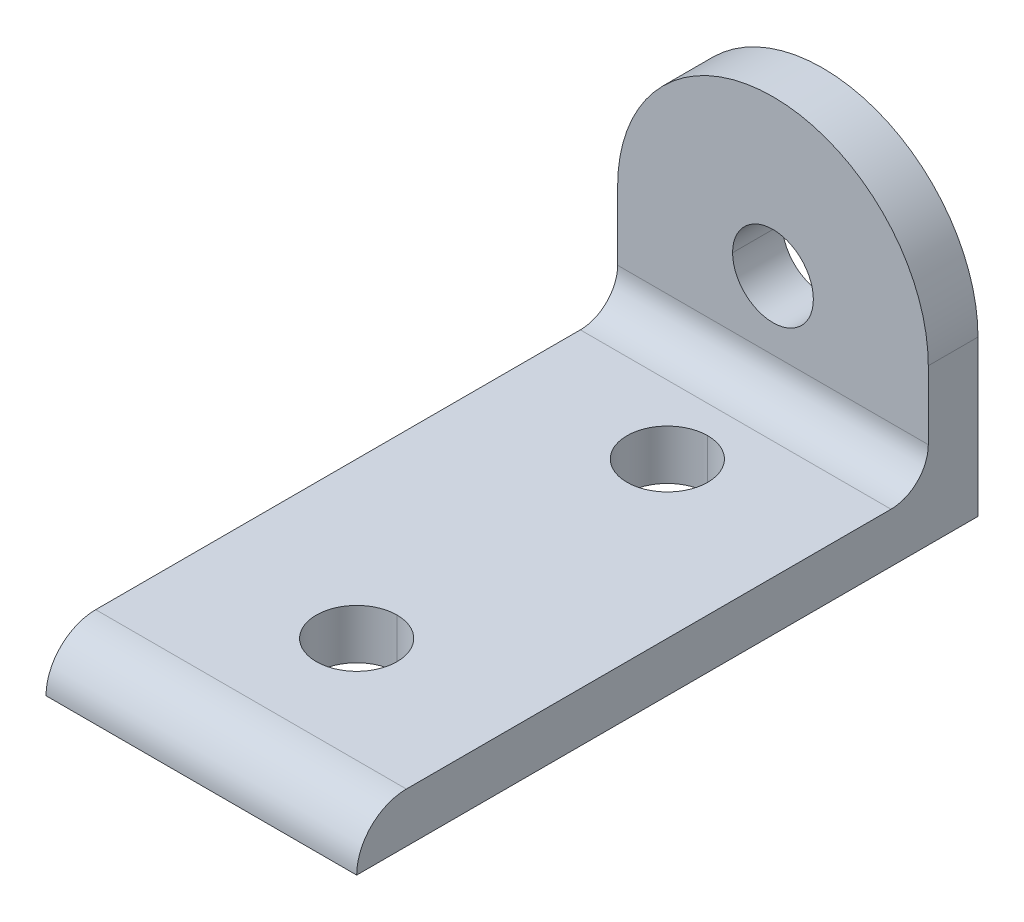
ISO-10303-21;
HEADER;
FILE_DESCRIPTION(('STEP AP214'),'2;1');
FILE_NAME('part.step','',(''),(''),'','','');
FILE_SCHEMA(('AUTOMOTIVE_DESIGN { 1 0 10303 214 1 1 1 1 }'));
ENDSEC;
DATA;
#1=APPLICATION_CONTEXT('core data for automotive mechanical design processes');
#2=APPLICATION_PROTOCOL_DEFINITION('international standard','automotive_design',2000,#1);
#3=PRODUCT_CONTEXT('',#1,'mechanical');
#4=PRODUCT('Part','Part','',(#3));
#5=PRODUCT_RELATED_PRODUCT_CATEGORY('part','',(#4));
#6=PRODUCT_DEFINITION_FORMATION('','',#4);
#7=PRODUCT_DEFINITION_CONTEXT('part definition',#1,'design');
#8=PRODUCT_DEFINITION('design','',#6,#7);
#9=PRODUCT_DEFINITION_SHAPE('','',#8);
#10=(LENGTH_UNIT() NAMED_UNIT(*) SI_UNIT(.MILLI.,.METRE.));
#11=(NAMED_UNIT(*) PLANE_ANGLE_UNIT() SI_UNIT($,.RADIAN.));
#12=(NAMED_UNIT(*) SI_UNIT($,.STERADIAN.) SOLID_ANGLE_UNIT());
#13=UNCERTAINTY_MEASURE_WITH_UNIT(LENGTH_MEASURE(1.E-05),#10,'distance_accuracy_value','');
#14=(GEOMETRIC_REPRESENTATION_CONTEXT(3) GLOBAL_UNCERTAINTY_ASSIGNED_CONTEXT((#13)) GLOBAL_UNIT_ASSIGNED_CONTEXT((#10,
#11,#12)) REPRESENTATION_CONTEXT('',''));
#15=CARTESIAN_POINT('',(0.,0.,0.));
#16=DIRECTION('',(0.,0.,1.));
#17=DIRECTION('',(1.,0.,0.));
#18=AXIS2_PLACEMENT_3D('',#15,#16,#17);
#19=CARTESIAN_POINT('',(12.5,-3.15719672627779E-13,46.));
#20=DIRECTION('',(1.,0.,0.));
#21=DIRECTION('',(0.,0.,-1.));
#22=AXIS2_PLACEMENT_3D('',#19,#20,#21);
#23=PLANE('',#22);
#24=DIRECTION('',(0.,1.,0.));
#25=VECTOR('',#24,1.);
#26=CARTESIAN_POINT('',(12.5,0.,0.));
#27=LINE('',#26,#25);
#28=CARTESIAN_POINT('',(12.5,0.,0.));
#29=VERTEX_POINT('',#28);
#30=CARTESIAN_POINT('',(12.5,12.5,0.));
#31=VERTEX_POINT('',#30);
#32=EDGE_CURVE('E11',#29,#31,#27,.T.);
#33=ORIENTED_EDGE('',*,*,#32,.T.);
#34=DIRECTION('',(0.,0.,-1.));
#35=VECTOR('',#34,1.);
#36=CARTESIAN_POINT('',(12.5,12.5,4.));
#37=LINE('',#36,#35);
#38=CARTESIAN_POINT('',(12.5,12.5,4.));
#39=VERTEX_POINT('',#38);
#40=EDGE_CURVE('E24',#39,#31,#37,.T.);
#41=ORIENTED_EDGE('',*,*,#40,.F.);
#42=DIRECTION('',(0.,-1.,0.));
#43=VECTOR('',#42,1.);
#44=CARTESIAN_POINT('',(12.5,25.,4.));
#45=LINE('',#44,#43);
#46=CARTESIAN_POINT('',(12.5,7.,4.));
#47=VERTEX_POINT('',#46);
#48=EDGE_CURVE('E259',#39,#47,#45,.T.);
#49=ORIENTED_EDGE('',*,*,#48,.T.);
#50=CARTESIAN_POINT('',(12.5,7.00000000000015,7.00000000000015));
#51=DIRECTION('',(1.,0.,0.));
#52=DIRECTION('',(0.,0.,-1.));
#53=AXIS2_PLACEMENT_3D('',#50,#51,#52);
#54=CIRCLE('',#53,3.00000000000014);
#55=CARTESIAN_POINT('',(12.5,4.,7.));
#56=VERTEX_POINT('',#55);
#57=EDGE_CURVE('E254',#56,#47,#54,.T.);
#58=ORIENTED_EDGE('',*,*,#57,.F.);
#59=DIRECTION('',(0.,0.,1.));
#60=VECTOR('',#59,1.);
#61=CARTESIAN_POINT('',(12.5,4.,7.));
#62=LINE('',#61,#60);
#63=CARTESIAN_POINT('',(12.5,4.,46.));
#64=VERTEX_POINT('',#63);
#65=EDGE_CURVE('E250',#56,#64,#62,.T.);
#66=ORIENTED_EDGE('',*,*,#65,.T.);
#67=CARTESIAN_POINT('',(12.5,-3.15719672627779E-13,46.));
#68=DIRECTION('',(1.,0.,0.));
#69=DIRECTION('',(0.,0.,-1.));
#70=AXIS2_PLACEMENT_3D('',#67,#68,#69);
#71=CIRCLE('',#70,4.00000000000032);
#72=CARTESIAN_POINT('',(12.5,0.,50.));
#73=VERTEX_POINT('',#72);
#74=EDGE_CURVE('E246',#64,#73,#71,.T.);
#75=ORIENTED_EDGE('',*,*,#74,.T.);
#76=DIRECTION('',(0.,0.,-1.));
#77=VECTOR('',#76,1.);
#78=CARTESIAN_POINT('',(12.5,0.,50.));
#79=LINE('',#78,#77);
#80=EDGE_CURVE('E242',#73,#29,#79,.T.);
#81=ORIENTED_EDGE('',*,*,#80,.T.);
#82=EDGE_LOOP('',(#33,#41,#49,#58,#66,#75,#81));
#83=FACE_BOUND('',#82,.T.);
#84=ADVANCED_FACE('F16',(#83),#23,.T.);
#85=CARTESIAN_POINT('',(12.5,0.,50.));
#86=DIRECTION('',(0.,1.,0.));
#87=DIRECTION('',(0.,0.,1.));
#88=AXIS2_PLACEMENT_3D('',#85,#86,#87);
#89=PLANE('',#88);
#90=CARTESIAN_POINT('',(0.,0.,12.5));
#91=DIRECTION('',(0.,1.,0.));
#92=DIRECTION('',(1.,0.,0.));
#93=AXIS2_PLACEMENT_3D('',#90,#91,#92);
#94=CIRCLE('',#93,3.25);
#95=CARTESIAN_POINT('',(0.,0.,9.25));
#96=VERTEX_POINT('',#95);
#97=CARTESIAN_POINT('',(0.,0.,15.75));
#98=VERTEX_POINT('',#97);
#99=EDGE_CURVE('E238',#96,#98,#94,.T.);
#100=ORIENTED_EDGE('',*,*,#99,.T.);
#101=CARTESIAN_POINT('',(0.,0.,12.5));
#102=DIRECTION('',(0.,1.,0.));
#103=DIRECTION('',(0.,0.,1.));
#104=AXIS2_PLACEMENT_3D('',#101,#102,#103);
#105=CIRCLE('',#104,3.25);
#106=EDGE_CURVE('E234',#98,#96,#105,.T.);
#107=ORIENTED_EDGE('',*,*,#106,.T.);
#108=EDGE_LOOP('',(#100,#107));
#109=FACE_BOUND('',#108,.T.);
#110=CARTESIAN_POINT('',(0.,0.,37.5));
#111=DIRECTION('',(0.,1.,0.));
#112=DIRECTION('',(1.,0.,0.));
#113=AXIS2_PLACEMENT_3D('',#110,#111,#112);
#114=CIRCLE('',#113,3.25);
#115=CARTESIAN_POINT('',(0.,0.,34.25));
#116=VERTEX_POINT('',#115);
#117=CARTESIAN_POINT('',(0.,0.,40.75));
#118=VERTEX_POINT('',#117);
#119=EDGE_CURVE('E230',#116,#118,#114,.T.);
#120=ORIENTED_EDGE('',*,*,#119,.T.);
#121=CARTESIAN_POINT('',(0.,0.,37.5));
#122=DIRECTION('',(0.,1.,0.));
#123=DIRECTION('',(0.,0.,1.));
#124=AXIS2_PLACEMENT_3D('',#121,#122,#123);
#125=CIRCLE('',#124,3.25);
#126=EDGE_CURVE('E226',#118,#116,#125,.T.);
#127=ORIENTED_EDGE('',*,*,#126,.T.);
#128=EDGE_LOOP('',(#120,#127));
#129=FACE_BOUND('',#128,.T.);
#130=DIRECTION('',(0.,0.,-1.));
#131=VECTOR('',#130,1.);
#132=CARTESIAN_POINT('',(-12.5,0.,50.));
#133=LINE('',#132,#131);
#134=CARTESIAN_POINT('',(-12.5,0.,50.));
#135=VERTEX_POINT('',#134);
#136=CARTESIAN_POINT('',(-12.5,0.,0.));
#137=VERTEX_POINT('',#136);
#138=EDGE_CURVE('E222',#135,#137,#133,.T.);
#139=ORIENTED_EDGE('',*,*,#138,.T.);
#140=DIRECTION('',(-1.,0.,0.));
#141=VECTOR('',#140,1.);
#142=CARTESIAN_POINT('',(12.5,0.,0.));
#143=LINE('',#142,#141);
#144=EDGE_CURVE('E217',#29,#137,#143,.T.);
#145=ORIENTED_EDGE('',*,*,#144,.F.);
#146=ORIENTED_EDGE('',*,*,#80,.F.);
#147=DIRECTION('',(-1.,0.,0.));
#148=VECTOR('',#147,1.);
#149=CARTESIAN_POINT('',(12.5,0.,50.));
#150=LINE('',#149,#148);
#151=EDGE_CURVE('E213',#73,#135,#150,.T.);
#152=ORIENTED_EDGE('',*,*,#151,.T.);
#153=EDGE_LOOP('',(#139,#145,#146,#152));
#154=FACE_BOUND('',#153,.T.);
#155=ADVANCED_FACE('F292',(#109,#129,#154),#89,.F.);
#156=CARTESIAN_POINT('',(12.5,-3.15719672627779E-13,46.));
#157=DIRECTION('',(-1.,0.,0.));
#158=DIRECTION('',(0.,-0.707106781186576,-0.707106781186519));
#159=AXIS2_PLACEMENT_3D('',#156,#157,#158);
#160=CYLINDRICAL_SURFACE('',#159,4.00000000000032);
#161=CARTESIAN_POINT('',(-12.5,-3.15719672627779E-13,46.));
#162=DIRECTION('',(1.,0.,0.));
#163=DIRECTION('',(0.,0.,-1.));
#164=AXIS2_PLACEMENT_3D('',#161,#162,#163);
#165=CIRCLE('',#164,4.00000000000032);
#166=CARTESIAN_POINT('',(-12.5,4.,46.));
#167=VERTEX_POINT('',#166);
#168=EDGE_CURVE('E208',#167,#135,#165,.T.);
#169=ORIENTED_EDGE('',*,*,#168,.T.);
#170=ORIENTED_EDGE('',*,*,#151,.F.);
#171=ORIENTED_EDGE('',*,*,#74,.F.);
#172=DIRECTION('',(-1.,0.,0.));
#173=VECTOR('',#172,1.);
#174=CARTESIAN_POINT('',(12.5,4.,46.));
#175=LINE('',#174,#173);
#176=EDGE_CURVE('E204',#64,#167,#175,.T.);
#177=ORIENTED_EDGE('',*,*,#176,.T.);
#178=EDGE_LOOP('',(#169,#170,#171,#177));
#179=FACE_BOUND('',#178,.T.);
#180=ADVANCED_FACE('F288',(#179),#160,.T.);
#181=CARTESIAN_POINT('',(12.5,4.,7.));
#182=DIRECTION('',(0.,-1.,0.));
#183=DIRECTION('',(0.,0.,-1.));
#184=AXIS2_PLACEMENT_3D('',#181,#182,#183);
#185=PLANE('',#184);
#186=CARTESIAN_POINT('',(0.,4.,12.5));
#187=DIRECTION('',(0.,1.,0.));
#188=DIRECTION('',(1.,0.,0.));
#189=AXIS2_PLACEMENT_3D('',#186,#187,#188);
#190=CIRCLE('',#189,3.25);
#191=CARTESIAN_POINT('',(0.,4.,9.25));
#192=VERTEX_POINT('',#191);
#193=CARTESIAN_POINT('',(0.,4.,15.75));
#194=VERTEX_POINT('',#193);
#195=EDGE_CURVE('E199',#192,#194,#190,.T.);
#196=ORIENTED_EDGE('',*,*,#195,.F.);
#197=CARTESIAN_POINT('',(0.,4.,12.5));
#198=DIRECTION('',(0.,1.,0.));
#199=DIRECTION('',(0.,0.,1.));
#200=AXIS2_PLACEMENT_3D('',#197,#198,#199);
#201=CIRCLE('',#200,3.25);
#202=EDGE_CURVE('E194',#194,#192,#201,.T.);
#203=ORIENTED_EDGE('',*,*,#202,.F.);
#204=EDGE_LOOP('',(#196,#203));
#205=FACE_BOUND('',#204,.T.);
#206=CARTESIAN_POINT('',(0.,4.,37.5));
#207=DIRECTION('',(0.,1.,0.));
#208=DIRECTION('',(1.,0.,0.));
#209=AXIS2_PLACEMENT_3D('',#206,#207,#208);
#210=CIRCLE('',#209,3.25);
#211=CARTESIAN_POINT('',(0.,4.,34.25));
#212=VERTEX_POINT('',#211);
#213=CARTESIAN_POINT('',(0.,4.,40.75));
#214=VERTEX_POINT('',#213);
#215=EDGE_CURVE('E189',#212,#214,#210,.T.);
#216=ORIENTED_EDGE('',*,*,#215,.F.);
#217=CARTESIAN_POINT('',(0.,4.,37.5));
#218=DIRECTION('',(0.,1.,0.));
#219=DIRECTION('',(0.,0.,1.));
#220=AXIS2_PLACEMENT_3D('',#217,#218,#219);
#221=CIRCLE('',#220,3.25);
#222=EDGE_CURVE('E184',#214,#212,#221,.T.);
#223=ORIENTED_EDGE('',*,*,#222,.F.);
#224=EDGE_LOOP('',(#216,#223));
#225=FACE_BOUND('',#224,.T.);
#226=DIRECTION('',(0.,0.,1.));
#227=VECTOR('',#226,1.);
#228=CARTESIAN_POINT('',(-12.5,4.,7.));
#229=LINE('',#228,#227);
#230=CARTESIAN_POINT('',(-12.5,4.,7.));
#231=VERTEX_POINT('',#230);
#232=EDGE_CURVE('E179',#231,#167,#229,.T.);
#233=ORIENTED_EDGE('',*,*,#232,.T.);
#234=ORIENTED_EDGE('',*,*,#176,.F.);
#235=ORIENTED_EDGE('',*,*,#65,.F.);
#236=DIRECTION('',(-1.,0.,0.));
#237=VECTOR('',#236,1.);
#238=CARTESIAN_POINT('',(12.5,4.,7.));
#239=LINE('',#238,#237);
#240=EDGE_CURVE('E175',#56,#231,#239,.T.);
#241=ORIENTED_EDGE('',*,*,#240,.T.);
#242=EDGE_LOOP('',(#233,#234,#235,#241));
#243=FACE_BOUND('',#242,.T.);
#244=ADVANCED_FACE('F283',(#205,#225,#243),#185,.F.);
#245=CARTESIAN_POINT('',(12.5,7.00000000000015,7.00000000000015));
#246=DIRECTION('',(-1.,0.,0.));
#247=DIRECTION('',(0.,0.70710678118653,0.707106781186565));
#248=AXIS2_PLACEMENT_3D('',#245,#246,#247);
#249=CYLINDRICAL_SURFACE('',#248,3.00000000000014);
#250=CARTESIAN_POINT('',(-12.5,7.00000000000015,7.00000000000015));
#251=DIRECTION('',(1.,0.,0.));
#252=DIRECTION('',(0.,0.,-1.));
#253=AXIS2_PLACEMENT_3D('',#250,#251,#252);
#254=CIRCLE('',#253,3.00000000000014);
#255=CARTESIAN_POINT('',(-12.5,7.,4.));
#256=VERTEX_POINT('',#255);
#257=EDGE_CURVE('E170',#231,#256,#254,.T.);
#258=ORIENTED_EDGE('',*,*,#257,.F.);
#259=ORIENTED_EDGE('',*,*,#240,.F.);
#260=ORIENTED_EDGE('',*,*,#57,.T.);
#261=DIRECTION('',(-1.,0.,0.));
#262=VECTOR('',#261,1.);
#263=CARTESIAN_POINT('',(12.5,7.,4.));
#264=LINE('',#263,#262);
#265=EDGE_CURVE('E166',#47,#256,#264,.T.);
#266=ORIENTED_EDGE('',*,*,#265,.T.);
#267=EDGE_LOOP('',(#258,#259,#260,#266));
#268=FACE_BOUND('',#267,.T.);
#269=ADVANCED_FACE('F280',(#268),#249,.F.);
#270=CARTESIAN_POINT('',(12.5,25.,4.));
#271=DIRECTION('',(0.,0.,-1.));
#272=DIRECTION('',(-1.,0.,0.));
#273=AXIS2_PLACEMENT_3D('',#270,#271,#272);
#274=PLANE('',#273);
#275=CARTESIAN_POINT('',(0.,12.5,4.));
#276=DIRECTION('',(0.,0.,1.));
#277=DIRECTION('',(1.,0.,0.));
#278=AXIS2_PLACEMENT_3D('',#275,#276,#277);
#279=CIRCLE('',#278,3.25);
#280=CARTESIAN_POINT('',(-3.25,12.5,4.));
#281=VERTEX_POINT('',#280);
#282=CARTESIAN_POINT('',(3.25,12.5,4.));
#283=VERTEX_POINT('',#282);
#284=EDGE_CURVE('E127',#281,#283,#279,.T.);
#285=ORIENTED_EDGE('',*,*,#284,.F.);
#286=CARTESIAN_POINT('',(0.,12.5,4.));
#287=DIRECTION('',(0.,0.,1.));
#288=DIRECTION('',(1.,0.,0.));
#289=AXIS2_PLACEMENT_3D('',#286,#287,#288);
#290=CIRCLE('',#289,3.25);
#291=EDGE_CURVE('E159',#283,#281,#290,.T.);
#292=ORIENTED_EDGE('',*,*,#291,.F.);
#293=EDGE_LOOP('',(#285,#292));
#294=FACE_BOUND('',#293,.T.);
#295=ORIENTED_EDGE('',*,*,#48,.F.);
#296=CARTESIAN_POINT('',(0.,12.5,4.));
#297=DIRECTION('',(0.,0.,1.));
#298=DIRECTION('',(1.,0.,0.));
#299=AXIS2_PLACEMENT_3D('',#296,#297,#298);
#300=CIRCLE('',#299,12.5);
#301=CARTESIAN_POINT('',(-12.5,12.5,4.));
#302=VERTEX_POINT('',#301);
#303=EDGE_CURVE('E155',#39,#302,#300,.T.);
#304=ORIENTED_EDGE('',*,*,#303,.T.);
#305=DIRECTION('',(0.,-1.,0.));
#306=VECTOR('',#305,1.);
#307=CARTESIAN_POINT('',(-12.5,25.,4.));
#308=LINE('',#307,#306);
#309=EDGE_CURVE('E150',#302,#256,#308,.T.);
#310=ORIENTED_EDGE('',*,*,#309,.T.);
#311=ORIENTED_EDGE('',*,*,#265,.F.);
#312=EDGE_LOOP('',(#295,#304,#310,#311));
#313=FACE_BOUND('',#312,.T.);
#314=ADVANCED_FACE('F274',(#294,#313),#274,.F.);
#315=CARTESIAN_POINT('',(-12.5,-3.15719672627779E-13,46.));
#316=DIRECTION('',(1.,0.,0.));
#317=DIRECTION('',(0.,0.,-1.));
#318=AXIS2_PLACEMENT_3D('',#315,#316,#317);
#319=PLANE('',#318);
#320=DIRECTION('',(0.,0.,-1.));
#321=VECTOR('',#320,1.);
#322=CARTESIAN_POINT('',(-12.5,12.5,4.));
#323=LINE('',#322,#321);
#324=CARTESIAN_POINT('',(-12.5,12.5,0.));
#325=VERTEX_POINT('',#324);
#326=EDGE_CURVE('E146',#302,#325,#323,.T.);
#327=ORIENTED_EDGE('',*,*,#326,.T.);
#328=DIRECTION('',(0.,1.,0.));
#329=VECTOR('',#328,1.);
#330=CARTESIAN_POINT('',(-12.5,0.,0.));
#331=LINE('',#330,#329);
#332=EDGE_CURVE('E124',#137,#325,#331,.T.);
#333=ORIENTED_EDGE('',*,*,#332,.F.);
#334=ORIENTED_EDGE('',*,*,#138,.F.);
#335=ORIENTED_EDGE('',*,*,#168,.F.);
#336=ORIENTED_EDGE('',*,*,#232,.F.);
#337=ORIENTED_EDGE('',*,*,#257,.T.);
#338=ORIENTED_EDGE('',*,*,#309,.F.);
#339=EDGE_LOOP('',(#327,#333,#334,#335,#336,#337,#338));
#340=FACE_BOUND('',#339,.T.);
#341=ADVANCED_FACE('F296',(#340),#319,.F.);
#342=CARTESIAN_POINT('',(12.5,0.,0.));
#343=DIRECTION('',(0.,0.,1.));
#344=DIRECTION('',(1.,0.,0.));
#345=AXIS2_PLACEMENT_3D('',#342,#343,#344);
#346=PLANE('',#345);
#347=CARTESIAN_POINT('',(0.,12.5,0.));
#348=DIRECTION('',(0.,0.,1.));
#349=DIRECTION('',(1.,0.,0.));
#350=AXIS2_PLACEMENT_3D('',#347,#348,#349);
#351=CIRCLE('',#350,3.25);
#352=CARTESIAN_POINT('',(3.25,12.5,0.));
#353=VERTEX_POINT('',#352);
#354=CARTESIAN_POINT('',(-3.25,12.5,0.));
#355=VERTEX_POINT('',#354);
#356=EDGE_CURVE('E110',#353,#355,#351,.T.);
#357=ORIENTED_EDGE('',*,*,#356,.T.);
#358=CARTESIAN_POINT('',(0.,12.5,0.));
#359=DIRECTION('',(0.,0.,1.));
#360=DIRECTION('',(1.,0.,0.));
#361=AXIS2_PLACEMENT_3D('',#358,#359,#360);
#362=CIRCLE('',#361,3.25);
#363=EDGE_CURVE('E106',#355,#353,#362,.T.);
#364=ORIENTED_EDGE('',*,*,#363,.T.);
#365=EDGE_LOOP('',(#357,#364));
#366=FACE_BOUND('',#365,.T.);
#367=ORIENTED_EDGE('',*,*,#332,.T.);
#368=CARTESIAN_POINT('',(0.,12.5,0.));
#369=DIRECTION('',(0.,0.,1.));
#370=DIRECTION('',(1.,0.,0.));
#371=AXIS2_PLACEMENT_3D('',#368,#369,#370);
#372=CIRCLE('',#371,12.5);
#373=EDGE_CURVE('E115',#31,#325,#372,.T.);
#374=ORIENTED_EDGE('',*,*,#373,.F.);
#375=ORIENTED_EDGE('',*,*,#32,.F.);
#376=ORIENTED_EDGE('',*,*,#144,.T.);
#377=EDGE_LOOP('',(#367,#374,#375,#376));
#378=FACE_BOUND('',#377,.T.);
#379=ADVANCED_FACE('F108',(#366,#378),#346,.F.);
#380=CARTESIAN_POINT('',(0.,12.5,4.));
#381=DIRECTION('',(0.,0.,-1.));
#382=DIRECTION('',(0.,-1.,0.));
#383=AXIS2_PLACEMENT_3D('',#380,#381,#382);
#384=CYLINDRICAL_SURFACE('',#383,12.5);
#385=ORIENTED_EDGE('',*,*,#373,.T.);
#386=ORIENTED_EDGE('',*,*,#326,.F.);
#387=ORIENTED_EDGE('',*,*,#303,.F.);
#388=ORIENTED_EDGE('',*,*,#40,.T.);
#389=EDGE_LOOP('',(#385,#386,#387,#388));
#390=FACE_BOUND('',#389,.T.);
#391=ADVANCED_FACE('F268',(#390),#384,.T.);
#392=CARTESIAN_POINT('',(0.,12.5,4.));
#393=DIRECTION('',(0.,0.,-1.));
#394=DIRECTION('',(0.,1.,0.));
#395=AXIS2_PLACEMENT_3D('',#392,#393,#394);
#396=CYLINDRICAL_SURFACE('',#395,3.25);
#397=DIRECTION('',(0.,0.,-1.));
#398=VECTOR('',#397,1.);
#399=CARTESIAN_POINT('',(3.25,12.5,4.));
#400=LINE('',#399,#398);
#401=EDGE_CURVE('E121',#283,#353,#400,.T.);
#402=ORIENTED_EDGE('',*,*,#401,.T.);
#403=ORIENTED_EDGE('',*,*,#363,.F.);
#404=DIRECTION('',(0.,0.,-1.));
#405=VECTOR('',#404,1.);
#406=CARTESIAN_POINT('',(-3.25,12.5,4.));
#407=LINE('',#406,#405);
#408=EDGE_CURVE('E123',#281,#355,#407,.T.);
#409=ORIENTED_EDGE('',*,*,#408,.F.);
#410=ORIENTED_EDGE('',*,*,#284,.T.);
#411=EDGE_LOOP('',(#402,#403,#409,#410));
#412=FACE_BOUND('',#411,.T.);
#413=ADVANCED_FACE('F126',(#412),#396,.F.);
#414=CARTESIAN_POINT('',(0.,12.5,4.));
#415=DIRECTION('',(0.,0.,-1.));
#416=DIRECTION('',(0.,-1.,0.));
#417=AXIS2_PLACEMENT_3D('',#414,#415,#416);
#418=CYLINDRICAL_SURFACE('',#417,3.25);
#419=ORIENTED_EDGE('',*,*,#401,.F.);
#420=ORIENTED_EDGE('',*,*,#291,.T.);
#421=ORIENTED_EDGE('',*,*,#408,.T.);
#422=ORIENTED_EDGE('',*,*,#356,.F.);
#423=EDGE_LOOP('',(#419,#420,#421,#422));
#424=FACE_BOUND('',#423,.T.);
#425=ADVANCED_FACE('F119',(#424),#418,.F.);
#426=CARTESIAN_POINT('',(0.,4.,37.5));
#427=DIRECTION('',(0.,-1.,0.));
#428=DIRECTION('',(-1.,0.,0.));
#429=AXIS2_PLACEMENT_3D('',#426,#427,#428);
#430=CYLINDRICAL_SURFACE('',#429,3.25);
#431=DIRECTION('',(0.,-1.,0.));
#432=VECTOR('',#431,1.);
#433=CARTESIAN_POINT('',(0.,4.,40.75));
#434=LINE('',#433,#432);
#435=EDGE_CURVE('E131',#214,#118,#434,.T.);
#436=ORIENTED_EDGE('',*,*,#435,.F.);
#437=ORIENTED_EDGE('',*,*,#222,.T.);
#438=DIRECTION('',(0.,-1.,0.));
#439=VECTOR('',#438,1.);
#440=CARTESIAN_POINT('',(0.,4.,34.25));
#441=LINE('',#440,#439);
#442=EDGE_CURVE('E475',#212,#116,#441,.T.);
#443=ORIENTED_EDGE('',*,*,#442,.T.);
#444=ORIENTED_EDGE('',*,*,#126,.F.);
#445=EDGE_LOOP('',(#436,#437,#443,#444));
#446=FACE_BOUND('',#445,.T.);
#447=ADVANCED_FACE('F376',(#446),#430,.F.);
#448=CARTESIAN_POINT('',(0.,4.,37.5));
#449=DIRECTION('',(0.,-1.,0.));
#450=DIRECTION('',(1.,0.,0.));
#451=AXIS2_PLACEMENT_3D('',#448,#449,#450);
#452=CYLINDRICAL_SURFACE('',#451,3.25);
#453=ORIENTED_EDGE('',*,*,#435,.T.);
#454=ORIENTED_EDGE('',*,*,#119,.F.);
#455=ORIENTED_EDGE('',*,*,#442,.F.);
#456=ORIENTED_EDGE('',*,*,#215,.T.);
#457=EDGE_LOOP('',(#453,#454,#455,#456));
#458=FACE_BOUND('',#457,.T.);
#459=ADVANCED_FACE('F386',(#458),#452,.F.);
#460=CARTESIAN_POINT('',(0.,4.,12.5));
#461=DIRECTION('',(0.,-1.,0.));
#462=DIRECTION('',(-1.,0.,0.));
#463=AXIS2_PLACEMENT_3D('',#460,#461,#462);
#464=CYLINDRICAL_SURFACE('',#463,3.25);
#465=DIRECTION('',(0.,-1.,0.));
#466=VECTOR('',#465,1.);
#467=CARTESIAN_POINT('',(0.,4.,15.75));
#468=LINE('',#467,#466);
#469=EDGE_CURVE('E471',#194,#98,#468,.T.);
#470=ORIENTED_EDGE('',*,*,#469,.F.);
#471=ORIENTED_EDGE('',*,*,#202,.T.);
#472=DIRECTION('',(0.,-1.,0.));
#473=VECTOR('',#472,1.);
#474=CARTESIAN_POINT('',(0.,4.,9.25));
#475=LINE('',#474,#473);
#476=EDGE_CURVE('E476',#192,#96,#475,.T.);
#477=ORIENTED_EDGE('',*,*,#476,.T.);
#478=ORIENTED_EDGE('',*,*,#106,.F.);
#479=EDGE_LOOP('',(#470,#471,#477,#478));
#480=FACE_BOUND('',#479,.T.);
#481=ADVANCED_FACE('F397',(#480),#464,.F.);
#482=CARTESIAN_POINT('',(0.,4.,12.5));
#483=DIRECTION('',(0.,-1.,0.));
#484=DIRECTION('',(1.,0.,0.));
#485=AXIS2_PLACEMENT_3D('',#482,#483,#484);
#486=CYLINDRICAL_SURFACE('',#485,3.25);
#487=ORIENTED_EDGE('',*,*,#469,.T.);
#488=ORIENTED_EDGE('',*,*,#99,.F.);
#489=ORIENTED_EDGE('',*,*,#476,.F.);
#490=ORIENTED_EDGE('',*,*,#195,.T.);
#491=EDGE_LOOP('',(#487,#488,#489,#490));
#492=FACE_BOUND('',#491,.T.);
#493=ADVANCED_FACE('F408',(#492),#486,.F.);
#494=CLOSED_SHELL('',(#84,#155,#180,#244,#269,#314,#341,#379,#391,#413,#425,#447,#459,#481,#493));
#495=MANIFOLD_SOLID_BREP('B1',#494);
#496=ADVANCED_BREP_SHAPE_REPRESENTATION('',(#18,#495),#14);
#497=SHAPE_DEFINITION_REPRESENTATION(#9,#496);
ENDSEC;
END-ISO-10303-21;
